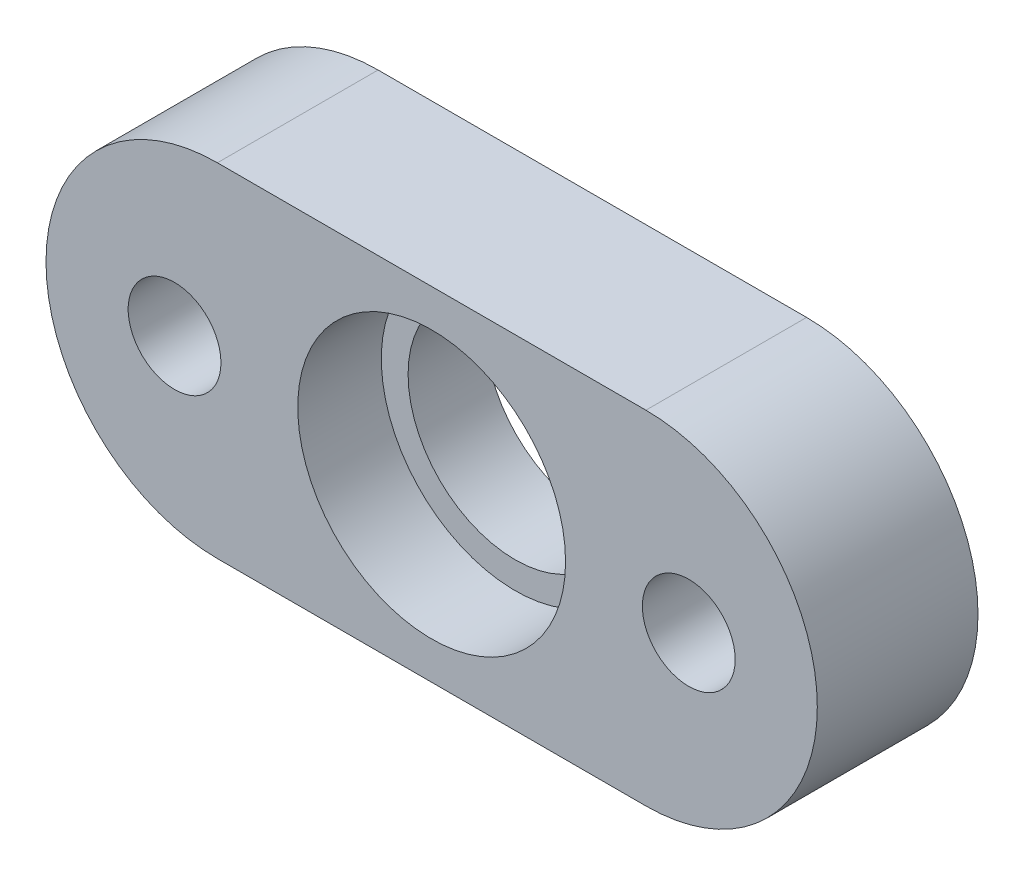
ISO-10303-21;
HEADER;
FILE_DESCRIPTION(('STEP AP214'),'2;1');
FILE_NAME('part.step','',(''),(''),'','','');
FILE_SCHEMA(('AUTOMOTIVE_DESIGN { 1 0 10303 214 1 1 1 1 }'));
ENDSEC;
DATA;
#1=APPLICATION_CONTEXT('core data for automotive mechanical design processes');
#2=APPLICATION_PROTOCOL_DEFINITION('international standard','automotive_design',2000,#1);
#3=PRODUCT_CONTEXT('',#1,'mechanical');
#4=PRODUCT('Part','Part','',(#3));
#5=PRODUCT_RELATED_PRODUCT_CATEGORY('part','',(#4));
#6=PRODUCT_DEFINITION_FORMATION('','',#4);
#7=PRODUCT_DEFINITION_CONTEXT('part definition',#1,'design');
#8=PRODUCT_DEFINITION('design','',#6,#7);
#9=PRODUCT_DEFINITION_SHAPE('','',#8);
#10=(LENGTH_UNIT() NAMED_UNIT(*) SI_UNIT(.MILLI.,.METRE.));
#11=(NAMED_UNIT(*) PLANE_ANGLE_UNIT() SI_UNIT($,.RADIAN.));
#12=(NAMED_UNIT(*) SI_UNIT($,.STERADIAN.) SOLID_ANGLE_UNIT());
#13=UNCERTAINTY_MEASURE_WITH_UNIT(LENGTH_MEASURE(1.E-05),#10,'distance_accuracy_value','');
#14=(GEOMETRIC_REPRESENTATION_CONTEXT(3) GLOBAL_UNCERTAINTY_ASSIGNED_CONTEXT((#13)) GLOBAL_UNIT_ASSIGNED_CONTEXT((#10,
#11,#12)) REPRESENTATION_CONTEXT('',''));
#15=CARTESIAN_POINT('',(0.,0.,0.));
#16=DIRECTION('',(0.,0.,1.));
#17=DIRECTION('',(1.,0.,0.));
#18=AXIS2_PLACEMENT_3D('',#15,#16,#17);
#19=CARTESIAN_POINT('',(-12.7,0.,9.525));
#20=DIRECTION('',(0.,0.,-1.));
#21=DIRECTION('',(-1.,0.,0.));
#22=AXIS2_PLACEMENT_3D('',#19,#20,#21);
#23=CYLINDRICAL_SURFACE('',#22,10.16);
#24=CARTESIAN_POINT('',(-12.7,0.,0.));
#25=DIRECTION('',(0.,0.,1.));
#26=DIRECTION('',(1.,0.,0.));
#27=AXIS2_PLACEMENT_3D('',#24,#25,#26);
#28=CIRCLE('',#27,10.16);
#29=CARTESIAN_POINT('',(-12.7,10.16,0.));
#30=VERTEX_POINT('',#29);
#31=CARTESIAN_POINT('',(-12.7,-10.16,0.));
#32=VERTEX_POINT('',#31);
#33=EDGE_CURVE('E99',#30,#32,#28,.T.);
#34=ORIENTED_EDGE('',*,*,#33,.T.);
#35=DIRECTION('',(0.,0.,-1.));
#36=VECTOR('',#35,1.);
#37=CARTESIAN_POINT('',(-12.7,-10.16,9.525));
#38=LINE('',#37,#36);
#39=CARTESIAN_POINT('',(-12.7,-10.16,9.525));
#40=VERTEX_POINT('',#39);
#41=EDGE_CURVE('E11',#40,#32,#38,.T.);
#42=ORIENTED_EDGE('',*,*,#41,.F.);
#43=CARTESIAN_POINT('',(-12.7,0.,9.525));
#44=DIRECTION('',(0.,0.,1.));
#45=DIRECTION('',(1.,0.,0.));
#46=AXIS2_PLACEMENT_3D('',#43,#44,#45);
#47=CIRCLE('',#46,10.16);
#48=CARTESIAN_POINT('',(-12.7,10.16,9.525));
#49=VERTEX_POINT('',#48);
#50=EDGE_CURVE('E86',#49,#40,#47,.T.);
#51=ORIENTED_EDGE('',*,*,#50,.F.);
#52=DIRECTION('',(0.,0.,-1.));
#53=VECTOR('',#52,1.);
#54=CARTESIAN_POINT('',(-12.7,10.16,9.525));
#55=LINE('',#54,#53);
#56=EDGE_CURVE('E95',#49,#30,#55,.T.);
#57=ORIENTED_EDGE('',*,*,#56,.T.);
#58=EDGE_LOOP('',(#34,#42,#51,#57));
#59=FACE_BOUND('',#58,.T.);
#60=ADVANCED_FACE('F34',(#59),#23,.T.);
#61=CARTESIAN_POINT('',(-12.7,-10.16,9.525));
#62=DIRECTION('',(0.,1.,0.));
#63=DIRECTION('',(-1.,0.,0.));
#64=AXIS2_PLACEMENT_3D('',#61,#62,#63);
#65=PLANE('',#64);
#66=DIRECTION('',(1.,0.,0.));
#67=VECTOR('',#66,1.);
#68=CARTESIAN_POINT('',(-12.7,-10.16,0.));
#69=LINE('',#68,#67);
#70=CARTESIAN_POINT('',(12.7,-10.16,0.));
#71=VERTEX_POINT('',#70);
#72=EDGE_CURVE('E90',#32,#71,#69,.T.);
#73=ORIENTED_EDGE('',*,*,#72,.T.);
#74=DIRECTION('',(0.,0.,-1.));
#75=VECTOR('',#74,1.);
#76=CARTESIAN_POINT('',(12.7,-10.16,9.525));
#77=LINE('',#76,#75);
#78=CARTESIAN_POINT('',(12.7,-10.16,9.525));
#79=VERTEX_POINT('',#78);
#80=EDGE_CURVE('E43',#79,#71,#77,.T.);
#81=ORIENTED_EDGE('',*,*,#80,.F.);
#82=DIRECTION('',(1.,0.,0.));
#83=VECTOR('',#82,1.);
#84=CARTESIAN_POINT('',(-12.7,-10.16,9.525));
#85=LINE('',#84,#83);
#86=EDGE_CURVE('E81',#40,#79,#85,.T.);
#87=ORIENTED_EDGE('',*,*,#86,.F.);
#88=ORIENTED_EDGE('',*,*,#41,.T.);
#89=EDGE_LOOP('',(#73,#81,#87,#88));
#90=FACE_BOUND('',#89,.T.);
#91=ADVANCED_FACE('F89',(#90),#65,.F.);
#92=CARTESIAN_POINT('',(12.7,0.,9.525));
#93=DIRECTION('',(0.,0.,-1.));
#94=DIRECTION('',(-1.,0.,0.));
#95=AXIS2_PLACEMENT_3D('',#92,#93,#94);
#96=CYLINDRICAL_SURFACE('',#95,10.16);
#97=CARTESIAN_POINT('',(12.7,0.,0.));
#98=DIRECTION('',(0.,0.,1.));
#99=DIRECTION('',(1.,0.,0.));
#100=AXIS2_PLACEMENT_3D('',#97,#98,#99);
#101=CIRCLE('',#100,10.16);
#102=CARTESIAN_POINT('',(12.7,10.16,0.));
#103=VERTEX_POINT('',#102);
#104=EDGE_CURVE('E68',#71,#103,#101,.T.);
#105=ORIENTED_EDGE('',*,*,#104,.T.);
#106=DIRECTION('',(0.,0.,-1.));
#107=VECTOR('',#106,1.);
#108=CARTESIAN_POINT('',(12.7,10.16,9.525));
#109=LINE('',#108,#107);
#110=CARTESIAN_POINT('',(12.7,10.16,9.525));
#111=VERTEX_POINT('',#110);
#112=EDGE_CURVE('E91',#111,#103,#109,.T.);
#113=ORIENTED_EDGE('',*,*,#112,.F.);
#114=CARTESIAN_POINT('',(12.7,0.,9.525));
#115=DIRECTION('',(0.,0.,1.));
#116=DIRECTION('',(1.,0.,0.));
#117=AXIS2_PLACEMENT_3D('',#114,#115,#116);
#118=CIRCLE('',#117,10.16);
#119=EDGE_CURVE('E84',#79,#111,#118,.T.);
#120=ORIENTED_EDGE('',*,*,#119,.F.);
#121=ORIENTED_EDGE('',*,*,#80,.T.);
#122=EDGE_LOOP('',(#105,#113,#120,#121));
#123=FACE_BOUND('',#122,.T.);
#124=ADVANCED_FACE('F93',(#123),#96,.T.);
#125=CARTESIAN_POINT('',(-12.7,10.16,9.525));
#126=DIRECTION('',(0.,-1.,0.));
#127=DIRECTION('',(1.,0.,0.));
#128=AXIS2_PLACEMENT_3D('',#125,#126,#127);
#129=PLANE('',#128);
#130=DIRECTION('',(-1.,0.,0.));
#131=VECTOR('',#130,1.);
#132=CARTESIAN_POINT('',(-12.7,10.16,0.));
#133=LINE('',#132,#131);
#134=EDGE_CURVE('E74',#103,#30,#133,.T.);
#135=ORIENTED_EDGE('',*,*,#134,.T.);
#136=ORIENTED_EDGE('',*,*,#56,.F.);
#137=DIRECTION('',(-1.,0.,0.));
#138=VECTOR('',#137,1.);
#139=CARTESIAN_POINT('',(-12.7,10.16,9.525));
#140=LINE('',#139,#138);
#141=EDGE_CURVE('E51',#111,#49,#140,.T.);
#142=ORIENTED_EDGE('',*,*,#141,.F.);
#143=ORIENTED_EDGE('',*,*,#112,.T.);
#144=EDGE_LOOP('',(#135,#136,#142,#143));
#145=FACE_BOUND('',#144,.T.);
#146=ADVANCED_FACE('F107',(#145),#129,.F.);
#147=CARTESIAN_POINT('',(-12.7,0.,9.525));
#148=DIRECTION('',(0.,0.,1.));
#149=DIRECTION('',(1.,0.,0.));
#150=AXIS2_PLACEMENT_3D('',#147,#148,#149);
#151=PLANE('',#150);
#152=CARTESIAN_POINT('',(15.24,0.,9.525));
#153=DIRECTION('',(0.,0.,1.));
#154=DIRECTION('',(-1.,0.,0.));
#155=AXIS2_PLACEMENT_3D('',#152,#153,#154);
#156=CIRCLE('',#155,2.75);
#157=CARTESIAN_POINT('',(17.99,0.,9.525));
#158=VERTEX_POINT('',#157);
#159=EDGE_CURVE('E122',#158,#158,#156,.T.);
#160=ORIENTED_EDGE('',*,*,#159,.F.);
#161=EDGE_LOOP('',(#160));
#162=FACE_BOUND('',#161,.T.);
#163=CARTESIAN_POINT('',(-15.24,0.,9.525));
#164=DIRECTION('',(0.,0.,1.));
#165=DIRECTION('',(1.,0.,0.));
#166=AXIS2_PLACEMENT_3D('',#163,#164,#165);
#167=CIRCLE('',#166,2.75);
#168=CARTESIAN_POINT('',(-12.49,0.,9.525));
#169=VERTEX_POINT('',#168);
#170=EDGE_CURVE('E128',#169,#169,#167,.T.);
#171=ORIENTED_EDGE('',*,*,#170,.F.);
#172=EDGE_LOOP('',(#171));
#173=FACE_BOUND('',#172,.T.);
#174=CARTESIAN_POINT('',(0.,0.,9.525));
#175=DIRECTION('',(0.,0.,1.));
#176=DIRECTION('',(1.,0.,0.));
#177=AXIS2_PLACEMENT_3D('',#174,#175,#176);
#178=CIRCLE('',#177,7.9375);
#179=CARTESIAN_POINT('',(7.9375,0.,9.525));
#180=VERTEX_POINT('',#179);
#181=EDGE_CURVE('E113',#180,#180,#178,.T.);
#182=ORIENTED_EDGE('',*,*,#181,.F.);
#183=EDGE_LOOP('',(#182));
#184=FACE_BOUND('',#183,.T.);
#185=ORIENTED_EDGE('',*,*,#50,.T.);
#186=ORIENTED_EDGE('',*,*,#86,.T.);
#187=ORIENTED_EDGE('',*,*,#119,.T.);
#188=ORIENTED_EDGE('',*,*,#141,.T.);
#189=EDGE_LOOP('',(#185,#186,#187,#188));
#190=FACE_BOUND('',#189,.T.);
#191=ADVANCED_FACE('F82',(#162,#173,#184,#190),#151,.T.);
#192=CARTESIAN_POINT('',(-12.7,0.,0.));
#193=DIRECTION('',(0.,0.,1.));
#194=DIRECTION('',(1.,0.,0.));
#195=AXIS2_PLACEMENT_3D('',#192,#193,#194);
#196=PLANE('',#195);
#197=CARTESIAN_POINT('',(15.24,0.,0.));
#198=DIRECTION('',(0.,0.,1.));
#199=DIRECTION('',(-1.,0.,0.));
#200=AXIS2_PLACEMENT_3D('',#197,#198,#199);
#201=CIRCLE('',#200,2.75);
#202=CARTESIAN_POINT('',(17.99,0.,0.));
#203=VERTEX_POINT('',#202);
#204=EDGE_CURVE('E125',#203,#203,#201,.T.);
#205=ORIENTED_EDGE('',*,*,#204,.T.);
#206=EDGE_LOOP('',(#205));
#207=FACE_BOUND('',#206,.T.);
#208=CARTESIAN_POINT('',(-15.24,0.,0.));
#209=DIRECTION('',(0.,0.,1.));
#210=DIRECTION('',(1.,0.,0.));
#211=AXIS2_PLACEMENT_3D('',#208,#209,#210);
#212=CIRCLE('',#211,2.75);
#213=CARTESIAN_POINT('',(-12.49,0.,0.));
#214=VERTEX_POINT('',#213);
#215=EDGE_CURVE('E121',#214,#214,#212,.T.);
#216=ORIENTED_EDGE('',*,*,#215,.T.);
#217=EDGE_LOOP('',(#216));
#218=FACE_BOUND('',#217,.T.);
#219=CARTESIAN_POINT('',(0.,0.,0.));
#220=DIRECTION('',(0.,0.,1.));
#221=DIRECTION('',(1.,0.,0.));
#222=AXIS2_PLACEMENT_3D('',#219,#220,#221);
#223=CIRCLE('',#222,6.35);
#224=CARTESIAN_POINT('',(6.35,0.,0.));
#225=VERTEX_POINT('',#224);
#226=EDGE_CURVE('E118',#225,#225,#223,.T.);
#227=ORIENTED_EDGE('',*,*,#226,.T.);
#228=EDGE_LOOP('',(#227));
#229=FACE_BOUND('',#228,.T.);
#230=ORIENTED_EDGE('',*,*,#33,.F.);
#231=ORIENTED_EDGE('',*,*,#134,.F.);
#232=ORIENTED_EDGE('',*,*,#104,.F.);
#233=ORIENTED_EDGE('',*,*,#72,.F.);
#234=EDGE_LOOP('',(#230,#231,#232,#233));
#235=FACE_BOUND('',#234,.T.);
#236=ADVANCED_FACE('F110',(#207,#218,#229,#235),#196,.F.);
#237=CARTESIAN_POINT('',(0.,0.,4.572));
#238=DIRECTION('',(0.,0.,1.));
#239=DIRECTION('',(1.,0.,0.));
#240=AXIS2_PLACEMENT_3D('',#237,#238,#239);
#241=CYLINDRICAL_SURFACE('',#240,7.9375);
#242=CARTESIAN_POINT('',(0.,0.,4.572));
#243=DIRECTION('',(0.,0.,1.));
#244=DIRECTION('',(1.,0.,0.));
#245=AXIS2_PLACEMENT_3D('',#242,#243,#244);
#246=CIRCLE('',#245,7.9375);
#247=CARTESIAN_POINT('',(7.9375,0.,4.572));
#248=VERTEX_POINT('',#247);
#249=EDGE_CURVE('E102',#248,#248,#246,.T.);
#250=ORIENTED_EDGE('',*,*,#249,.F.);
#251=EDGE_LOOP('',(#250));
#252=FACE_BOUND('',#251,.T.);
#253=ORIENTED_EDGE('',*,*,#181,.T.);
#254=EDGE_LOOP('',(#253));
#255=FACE_BOUND('',#254,.T.);
#256=ADVANCED_FACE('F150',(#252,#255),#241,.F.);
#257=CARTESIAN_POINT('',(0.,0.,4.572));
#258=DIRECTION('',(0.,0.,1.));
#259=DIRECTION('',(1.,0.,0.));
#260=AXIS2_PLACEMENT_3D('',#257,#258,#259);
#261=PLANE('',#260);
#262=CARTESIAN_POINT('',(0.,0.,4.572));
#263=DIRECTION('',(0.,0.,1.));
#264=DIRECTION('',(1.,0.,0.));
#265=AXIS2_PLACEMENT_3D('',#262,#263,#264);
#266=CIRCLE('',#265,6.35);
#267=CARTESIAN_POINT('',(6.35,0.,4.572));
#268=VERTEX_POINT('',#267);
#269=EDGE_CURVE('E37',#268,#268,#266,.T.);
#270=ORIENTED_EDGE('',*,*,#269,.F.);
#271=EDGE_LOOP('',(#270));
#272=FACE_BOUND('',#271,.T.);
#273=ORIENTED_EDGE('',*,*,#249,.T.);
#274=EDGE_LOOP('',(#273));
#275=FACE_BOUND('',#274,.T.);
#276=ADVANCED_FACE('F152',(#272,#275),#261,.T.);
#277=CARTESIAN_POINT('',(0.,0.,0.));
#278=DIRECTION('',(0.,0.,1.));
#279=DIRECTION('',(1.,0.,0.));
#280=AXIS2_PLACEMENT_3D('',#277,#278,#279);
#281=CYLINDRICAL_SURFACE('',#280,6.35);
#282=CARTESIAN_POINT('',(6.35,0.,4.572));
#283=CARTESIAN_POINT('',(6.35,0.,4.524375));
#284=CARTESIAN_POINT('',(6.35,0.,4.47675));
#285=CARTESIAN_POINT('',(6.35,0.,4.3815));
#286=CARTESIAN_POINT('',(6.35,0.,4.333875));
#287=CARTESIAN_POINT('',(6.35,0.,4.238625));
#288=CARTESIAN_POINT('',(6.35,0.,4.191));
#289=CARTESIAN_POINT('',(6.35,0.,4.09575));
#290=CARTESIAN_POINT('',(6.35,0.,4.048125));
#291=CARTESIAN_POINT('',(6.35,0.,3.952875));
#292=CARTESIAN_POINT('',(6.35,0.,3.90525));
#293=CARTESIAN_POINT('',(6.35,0.,3.81));
#294=CARTESIAN_POINT('',(6.35,0.,3.762375));
#295=CARTESIAN_POINT('',(6.35,0.,3.667125));
#296=CARTESIAN_POINT('',(6.35,0.,3.6195));
#297=CARTESIAN_POINT('',(6.35,0.,3.52425));
#298=CARTESIAN_POINT('',(6.35,0.,3.476625));
#299=CARTESIAN_POINT('',(6.35,0.,3.381375));
#300=CARTESIAN_POINT('',(6.35,0.,3.33375));
#301=CARTESIAN_POINT('',(6.35,0.,3.2385));
#302=CARTESIAN_POINT('',(6.35,0.,3.190875));
#303=CARTESIAN_POINT('',(6.35,0.,3.095625));
#304=CARTESIAN_POINT('',(6.35,0.,3.048));
#305=CARTESIAN_POINT('',(6.35,0.,2.95275));
#306=CARTESIAN_POINT('',(6.35,0.,2.905125));
#307=CARTESIAN_POINT('',(6.35,0.,2.809875));
#308=CARTESIAN_POINT('',(6.35,0.,2.76225));
#309=CARTESIAN_POINT('',(6.35,0.,2.667));
#310=CARTESIAN_POINT('',(6.35,0.,2.619375));
#311=CARTESIAN_POINT('',(6.35,0.,2.524125));
#312=CARTESIAN_POINT('',(6.35,0.,2.4765));
#313=CARTESIAN_POINT('',(6.35,0.,2.38125));
#314=CARTESIAN_POINT('',(6.35,0.,2.333625));
#315=CARTESIAN_POINT('',(6.35,0.,2.238375));
#316=CARTESIAN_POINT('',(6.35,0.,2.19075));
#317=CARTESIAN_POINT('',(6.35,0.,2.0955));
#318=CARTESIAN_POINT('',(6.35,0.,2.047875));
#319=CARTESIAN_POINT('',(6.35,0.,1.952625));
#320=CARTESIAN_POINT('',(6.35,0.,1.905));
#321=CARTESIAN_POINT('',(6.35,0.,1.80975));
#322=CARTESIAN_POINT('',(6.35,0.,1.762125));
#323=CARTESIAN_POINT('',(6.35,0.,1.666875));
#324=CARTESIAN_POINT('',(6.35,0.,1.61925));
#325=CARTESIAN_POINT('',(6.35,0.,1.524));
#326=CARTESIAN_POINT('',(6.35,0.,1.476375));
#327=CARTESIAN_POINT('',(6.35,0.,1.381125));
#328=CARTESIAN_POINT('',(6.35,0.,1.3335));
#329=CARTESIAN_POINT('',(6.35,0.,1.23825));
#330=CARTESIAN_POINT('',(6.35,0.,1.190625));
#331=CARTESIAN_POINT('',(6.35,0.,1.095375));
#332=CARTESIAN_POINT('',(6.35,0.,1.04775));
#333=CARTESIAN_POINT('',(6.35,0.,0.9525));
#334=CARTESIAN_POINT('',(6.35,0.,0.904875));
#335=CARTESIAN_POINT('',(6.35,0.,0.809625));
#336=CARTESIAN_POINT('',(6.35,0.,0.762));
#337=CARTESIAN_POINT('',(6.35,0.,0.66675));
#338=CARTESIAN_POINT('',(6.35,0.,0.619125));
#339=CARTESIAN_POINT('',(6.35,0.,0.523875));
#340=CARTESIAN_POINT('',(6.35,0.,0.47625));
#341=CARTESIAN_POINT('',(6.35,0.,0.381));
#342=CARTESIAN_POINT('',(6.35,0.,0.333375));
#343=CARTESIAN_POINT('',(6.35,0.,0.238125));
#344=CARTESIAN_POINT('',(6.35,0.,0.1905));
#345=CARTESIAN_POINT('',(6.35,0.,0.0952499999999999));
#346=CARTESIAN_POINT('',(6.35,0.,0.047625));
#347=CARTESIAN_POINT('',(6.35,0.,0.));
#348=B_SPLINE_CURVE_WITH_KNOTS('',3,(#282,#283,#284,#285,#286,#287,#288,#289,#290,#291,#292,
#293,#294,#295,#296,#297,#298,#299,#300,#301,#302,#303,#304,#305,#306,#307,#308,#309,#310,#311,
#312,#313,#314,#315,#316,#317,#318,#319,#320,#321,#322,#323,#324,#325,#326,#327,#328,#329,#330,
#331,#332,#333,#334,#335,#336,#337,#338,#339,#340,#341,#342,#343,#344,#345,#346,#347),
.UNSPECIFIED.,.F.,.F.,(4,2,2,2,2,2,2,2,2,2,2,2,2,2,2,2,2,2,2,2,2,2,2,2,2,2,2,2,2,2,2,2,4),(0.,
0.142875,0.28575,0.428625,0.5715,0.714375,0.85725,1.000125,1.143,1.285875,1.42875,1.571625,
1.7145,1.857375,2.00025,2.143125,2.286,2.428875,2.57175,2.714625,2.8575,3.000375,3.14325,
3.286125,3.429,3.571875,3.71475,3.857625,4.0005,4.143375,4.28625,4.429125,4.572),.UNSPECIFIED.);
#349=EDGE_CURVE('BSEAM140',#268,#225,#348,.T.);
#350=ORIENTED_EDGE('',*,*,#269,.T.);
#351=ORIENTED_EDGE('',*,*,#226,.F.);
#352=ORIENTED_EDGE('',*,*,#349,.T.);
#353=ORIENTED_EDGE('',*,*,#349,.F.);
#354=EDGE_LOOP('',(#350,#352,#351,#353));
#355=FACE_BOUND('',#354,.T.);
#356=ADVANCED_FACE('F140',(#355),#281,.F.);
#357=CARTESIAN_POINT('',(-15.24,0.,0.));
#358=DIRECTION('',(0.,0.,1.));
#359=DIRECTION('',(1.,0.,0.));
#360=AXIS2_PLACEMENT_3D('',#357,#358,#359);
#361=CYLINDRICAL_SURFACE('',#360,2.75);
#362=CARTESIAN_POINT('',(-12.49,0.,0.));
#363=CARTESIAN_POINT('',(-12.49,0.,0.0992187499999999));
#364=CARTESIAN_POINT('',(-12.49,0.,0.1984375));
#365=CARTESIAN_POINT('',(-12.49,0.,0.396875));
#366=CARTESIAN_POINT('',(-12.49,0.,0.49609375));
#367=CARTESIAN_POINT('',(-12.49,0.,0.69453125));
#368=CARTESIAN_POINT('',(-12.49,0.,0.79375));
#369=CARTESIAN_POINT('',(-12.49,0.,0.9921875));
#370=CARTESIAN_POINT('',(-12.49,0.,1.09140625));
#371=CARTESIAN_POINT('',(-12.49,0.,1.28984375));
#372=CARTESIAN_POINT('',(-12.49,0.,1.3890625));
#373=CARTESIAN_POINT('',(-12.49,0.,1.5875));
#374=CARTESIAN_POINT('',(-12.49,0.,1.68671875));
#375=CARTESIAN_POINT('',(-12.49,0.,1.88515625));
#376=CARTESIAN_POINT('',(-12.49,0.,1.984375));
#377=CARTESIAN_POINT('',(-12.49,0.,2.1828125));
#378=CARTESIAN_POINT('',(-12.49,0.,2.28203125));
#379=CARTESIAN_POINT('',(-12.49,0.,2.48046875));
#380=CARTESIAN_POINT('',(-12.49,0.,2.5796875));
#381=CARTESIAN_POINT('',(-12.49,0.,2.778125));
#382=CARTESIAN_POINT('',(-12.49,0.,2.87734375));
#383=CARTESIAN_POINT('',(-12.49,0.,3.07578125));
#384=CARTESIAN_POINT('',(-12.49,0.,3.175));
#385=CARTESIAN_POINT('',(-12.49,0.,3.3734375));
#386=CARTESIAN_POINT('',(-12.49,0.,3.47265625));
#387=CARTESIAN_POINT('',(-12.49,0.,3.67109375));
#388=CARTESIAN_POINT('',(-12.49,0.,3.7703125));
#389=CARTESIAN_POINT('',(-12.49,0.,3.96875));
#390=CARTESIAN_POINT('',(-12.49,0.,4.06796875));
#391=CARTESIAN_POINT('',(-12.49,0.,4.26640625));
#392=CARTESIAN_POINT('',(-12.49,0.,4.365625));
#393=CARTESIAN_POINT('',(-12.49,0.,4.5640625));
#394=CARTESIAN_POINT('',(-12.49,0.,4.66328125));
#395=CARTESIAN_POINT('',(-12.49,0.,4.86171875));
#396=CARTESIAN_POINT('',(-12.49,0.,4.9609375));
#397=CARTESIAN_POINT('',(-12.49,0.,5.159375));
#398=CARTESIAN_POINT('',(-12.49,0.,5.25859375));
#399=CARTESIAN_POINT('',(-12.49,0.,5.45703125));
#400=CARTESIAN_POINT('',(-12.49,0.,5.55625));
#401=CARTESIAN_POINT('',(-12.49,0.,5.7546875));
#402=CARTESIAN_POINT('',(-12.49,0.,5.85390625));
#403=CARTESIAN_POINT('',(-12.49,0.,6.05234375));
#404=CARTESIAN_POINT('',(-12.49,0.,6.1515625));
#405=CARTESIAN_POINT('',(-12.49,0.,6.35));
#406=CARTESIAN_POINT('',(-12.49,0.,6.44921875));
#407=CARTESIAN_POINT('',(-12.49,0.,6.64765625));
#408=CARTESIAN_POINT('',(-12.49,0.,6.746875));
#409=CARTESIAN_POINT('',(-12.49,0.,6.9453125));
#410=CARTESIAN_POINT('',(-12.49,0.,7.04453125));
#411=CARTESIAN_POINT('',(-12.49,0.,7.24296875));
#412=CARTESIAN_POINT('',(-12.49,0.,7.3421875));
#413=CARTESIAN_POINT('',(-12.49,0.,7.540625));
#414=CARTESIAN_POINT('',(-12.49,0.,7.63984375));
#415=CARTESIAN_POINT('',(-12.49,0.,7.83828125));
#416=CARTESIAN_POINT('',(-12.49,0.,7.9375));
#417=CARTESIAN_POINT('',(-12.49,0.,8.1359375));
#418=CARTESIAN_POINT('',(-12.49,0.,8.23515625));
#419=CARTESIAN_POINT('',(-12.49,0.,8.43359375));
#420=CARTESIAN_POINT('',(-12.49,0.,8.5328125));
#421=CARTESIAN_POINT('',(-12.49,0.,8.73125));
#422=CARTESIAN_POINT('',(-12.49,0.,8.83046875));
#423=CARTESIAN_POINT('',(-12.49,0.,9.02890625));
#424=CARTESIAN_POINT('',(-12.49,0.,9.128125));
#425=CARTESIAN_POINT('',(-12.49,0.,9.3265625));
#426=CARTESIAN_POINT('',(-12.49,0.,9.42578125));
#427=CARTESIAN_POINT('',(-12.49,0.,9.525));
#428=B_SPLINE_CURVE_WITH_KNOTS('',3,(#362,#363,#364,#365,#366,#367,#368,#369,#370,#371,#372,
#373,#374,#375,#376,#377,#378,#379,#380,#381,#382,#383,#384,#385,#386,#387,#388,#389,#390,#391,
#392,#393,#394,#395,#396,#397,#398,#399,#400,#401,#402,#403,#404,#405,#406,#407,#408,#409,#410,
#411,#412,#413,#414,#415,#416,#417,#418,#419,#420,#421,#422,#423,#424,#425,#426,#427),
.UNSPECIFIED.,.F.,.F.,(4,2,2,2,2,2,2,2,2,2,2,2,2,2,2,2,2,2,2,2,2,2,2,2,2,2,2,2,2,2,2,2,4),(0.,
0.29765625,0.5953125,0.89296875,1.190625,1.48828125,1.7859375,2.08359375,2.38125,2.67890625,
2.9765625,3.27421875,3.571875,3.86953125,4.1671875,4.46484375,4.7625,5.06015625,5.3578125,
5.65546875,5.953125,6.25078125,6.5484375,6.84609375,7.14375,7.44140625,7.7390625,8.03671875,
8.334375,8.63203125,8.9296875,9.22734375,9.525),.UNSPECIFIED.);
#429=EDGE_CURVE('BSEAM136',#214,#169,#428,.T.);
#430=ORIENTED_EDGE('',*,*,#215,.F.);
#431=ORIENTED_EDGE('',*,*,#170,.T.);
#432=ORIENTED_EDGE('',*,*,#429,.T.);
#433=ORIENTED_EDGE('',*,*,#429,.F.);
#434=EDGE_LOOP('',(#430,#432,#431,#433));
#435=FACE_BOUND('',#434,.T.);
#436=ADVANCED_FACE('F136',(#435),#361,.F.);
#437=CARTESIAN_POINT('',(15.24,0.,0.));
#438=DIRECTION('',(0.,0.,1.));
#439=DIRECTION('',(1.,0.,0.));
#440=AXIS2_PLACEMENT_3D('',#437,#438,#439);
#441=CYLINDRICAL_SURFACE('',#440,2.75);
#442=CARTESIAN_POINT('',(17.99,0.,0.));
#443=CARTESIAN_POINT('',(17.99,0.,0.0992187499999999));
#444=CARTESIAN_POINT('',(17.99,0.,0.1984375));
#445=CARTESIAN_POINT('',(17.99,0.,0.396875));
#446=CARTESIAN_POINT('',(17.99,0.,0.49609375));
#447=CARTESIAN_POINT('',(17.99,0.,0.69453125));
#448=CARTESIAN_POINT('',(17.99,0.,0.79375));
#449=CARTESIAN_POINT('',(17.99,0.,0.9921875));
#450=CARTESIAN_POINT('',(17.99,0.,1.09140625));
#451=CARTESIAN_POINT('',(17.99,0.,1.28984375));
#452=CARTESIAN_POINT('',(17.99,0.,1.3890625));
#453=CARTESIAN_POINT('',(17.99,0.,1.5875));
#454=CARTESIAN_POINT('',(17.99,0.,1.68671875));
#455=CARTESIAN_POINT('',(17.99,0.,1.88515625));
#456=CARTESIAN_POINT('',(17.99,0.,1.984375));
#457=CARTESIAN_POINT('',(17.99,0.,2.1828125));
#458=CARTESIAN_POINT('',(17.99,0.,2.28203125));
#459=CARTESIAN_POINT('',(17.99,0.,2.48046875));
#460=CARTESIAN_POINT('',(17.99,0.,2.5796875));
#461=CARTESIAN_POINT('',(17.99,0.,2.778125));
#462=CARTESIAN_POINT('',(17.99,0.,2.87734375));
#463=CARTESIAN_POINT('',(17.99,0.,3.07578125));
#464=CARTESIAN_POINT('',(17.99,0.,3.175));
#465=CARTESIAN_POINT('',(17.99,0.,3.3734375));
#466=CARTESIAN_POINT('',(17.99,0.,3.47265625));
#467=CARTESIAN_POINT('',(17.99,0.,3.67109375));
#468=CARTESIAN_POINT('',(17.99,0.,3.7703125));
#469=CARTESIAN_POINT('',(17.99,0.,3.96875));
#470=CARTESIAN_POINT('',(17.99,0.,4.06796875));
#471=CARTESIAN_POINT('',(17.99,0.,4.26640625));
#472=CARTESIAN_POINT('',(17.99,0.,4.365625));
#473=CARTESIAN_POINT('',(17.99,0.,4.5640625));
#474=CARTESIAN_POINT('',(17.99,0.,4.66328125));
#475=CARTESIAN_POINT('',(17.99,0.,4.86171875));
#476=CARTESIAN_POINT('',(17.99,0.,4.9609375));
#477=CARTESIAN_POINT('',(17.99,0.,5.159375));
#478=CARTESIAN_POINT('',(17.99,0.,5.25859375));
#479=CARTESIAN_POINT('',(17.99,0.,5.45703125));
#480=CARTESIAN_POINT('',(17.99,0.,5.55625));
#481=CARTESIAN_POINT('',(17.99,0.,5.7546875));
#482=CARTESIAN_POINT('',(17.99,0.,5.85390625));
#483=CARTESIAN_POINT('',(17.99,0.,6.05234375));
#484=CARTESIAN_POINT('',(17.99,0.,6.1515625));
#485=CARTESIAN_POINT('',(17.99,0.,6.35));
#486=CARTESIAN_POINT('',(17.99,0.,6.44921875));
#487=CARTESIAN_POINT('',(17.99,0.,6.64765625));
#488=CARTESIAN_POINT('',(17.99,0.,6.746875));
#489=CARTESIAN_POINT('',(17.99,0.,6.9453125));
#490=CARTESIAN_POINT('',(17.99,0.,7.04453125));
#491=CARTESIAN_POINT('',(17.99,0.,7.24296875));
#492=CARTESIAN_POINT('',(17.99,0.,7.3421875));
#493=CARTESIAN_POINT('',(17.99,0.,7.540625));
#494=CARTESIAN_POINT('',(17.99,0.,7.63984375));
#495=CARTESIAN_POINT('',(17.99,0.,7.83828125));
#496=CARTESIAN_POINT('',(17.99,0.,7.9375));
#497=CARTESIAN_POINT('',(17.99,0.,8.1359375));
#498=CARTESIAN_POINT('',(17.99,0.,8.23515625));
#499=CARTESIAN_POINT('',(17.99,0.,8.43359375));
#500=CARTESIAN_POINT('',(17.99,0.,8.5328125));
#501=CARTESIAN_POINT('',(17.99,0.,8.73125));
#502=CARTESIAN_POINT('',(17.99,0.,8.83046875));
#503=CARTESIAN_POINT('',(17.99,0.,9.02890625));
#504=CARTESIAN_POINT('',(17.99,0.,9.128125));
#505=CARTESIAN_POINT('',(17.99,0.,9.3265625));
#506=CARTESIAN_POINT('',(17.99,0.,9.42578125));
#507=CARTESIAN_POINT('',(17.99,0.,9.525));
#508=B_SPLINE_CURVE_WITH_KNOTS('',3,(#442,#443,#444,#445,#446,#447,#448,#449,#450,#451,#452,
#453,#454,#455,#456,#457,#458,#459,#460,#461,#462,#463,#464,#465,#466,#467,#468,#469,#470,#471,
#472,#473,#474,#475,#476,#477,#478,#479,#480,#481,#482,#483,#484,#485,#486,#487,#488,#489,#490,
#491,#492,#493,#494,#495,#496,#497,#498,#499,#500,#501,#502,#503,#504,#505,#506,#507),
.UNSPECIFIED.,.F.,.F.,(4,2,2,2,2,2,2,2,2,2,2,2,2,2,2,2,2,2,2,2,2,2,2,2,2,2,2,2,2,2,2,2,4),(0.,
0.29765625,0.5953125,0.89296875,1.190625,1.48828125,1.7859375,2.08359375,2.38125,2.67890625,
2.9765625,3.27421875,3.571875,3.86953125,4.1671875,4.46484375,4.7625,5.06015625,5.3578125,
5.65546875,5.953125,6.25078125,6.5484375,6.84609375,7.14375,7.44140625,7.7390625,8.03671875,
8.334375,8.63203125,8.9296875,9.22734375,9.525),.UNSPECIFIED.);
#509=EDGE_CURVE('BSEAM139',#203,#158,#508,.T.);
#510=ORIENTED_EDGE('',*,*,#204,.F.);
#511=ORIENTED_EDGE('',*,*,#159,.T.);
#512=ORIENTED_EDGE('',*,*,#509,.T.);
#513=ORIENTED_EDGE('',*,*,#509,.F.);
#514=EDGE_LOOP('',(#510,#512,#511,#513));
#515=FACE_BOUND('',#514,.T.);
#516=ADVANCED_FACE('F139',(#515),#441,.F.);
#517=CLOSED_SHELL('',(#60,#91,#124,#146,#191,#236,#256,#276,#356,#436,#516));
#518=MANIFOLD_SOLID_BREP('B2',#517);
#519=ADVANCED_BREP_SHAPE_REPRESENTATION('',(#18,#518),#14);
#520=SHAPE_DEFINITION_REPRESENTATION(#9,#519);
ENDSEC;
END-ISO-10303-21;
